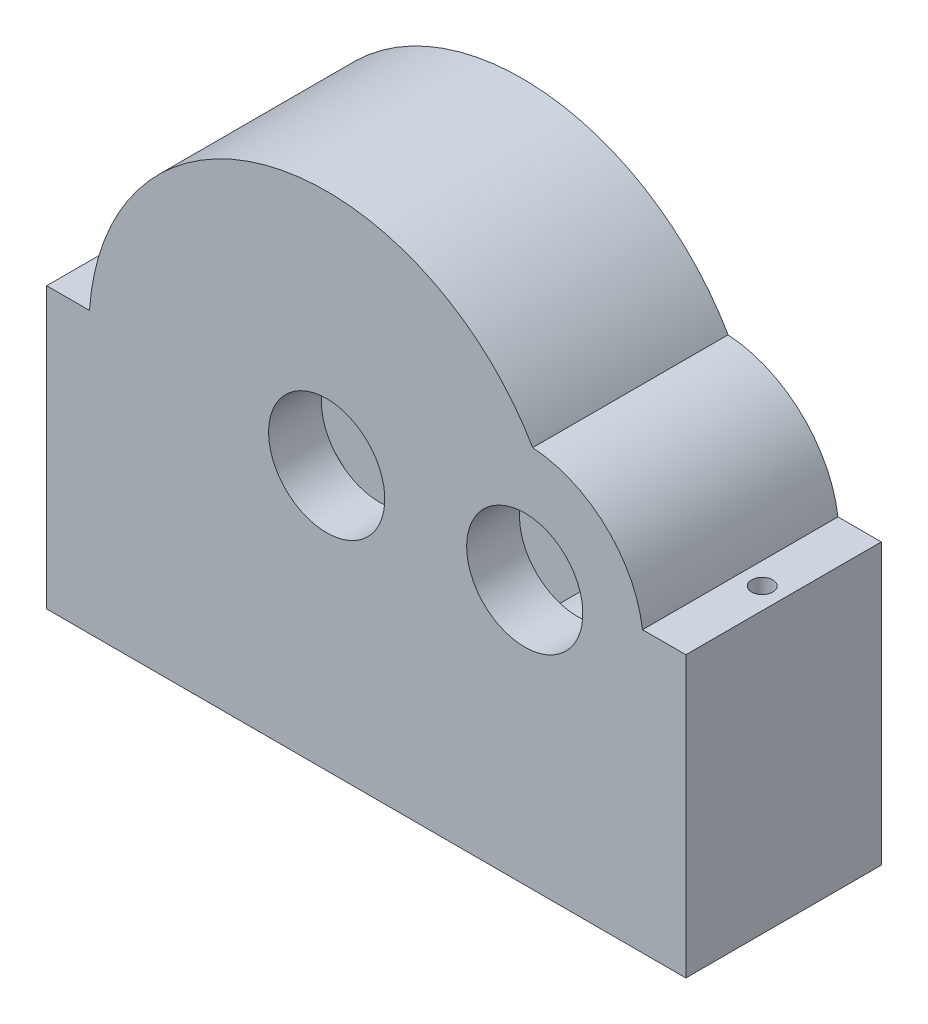
ISO-10303-21;
HEADER;
FILE_DESCRIPTION(('STEP AP214'),'2;1');
FILE_NAME('part.step','',(''),(''),'','','');
FILE_SCHEMA(('AUTOMOTIVE_DESIGN { 1 0 10303 214 1 1 1 1 }'));
ENDSEC;
DATA;
#1=APPLICATION_CONTEXT('core data for automotive mechanical design processes');
#2=APPLICATION_PROTOCOL_DEFINITION('international standard','automotive_design',2000,#1);
#3=PRODUCT_CONTEXT('',#1,'mechanical');
#4=PRODUCT('Part','Part','',(#3));
#5=PRODUCT_RELATED_PRODUCT_CATEGORY('part','',(#4));
#6=PRODUCT_DEFINITION_FORMATION('','',#4);
#7=PRODUCT_DEFINITION_CONTEXT('part definition',#1,'design');
#8=PRODUCT_DEFINITION('design','',#6,#7);
#9=PRODUCT_DEFINITION_SHAPE('','',#8);
#10=(LENGTH_UNIT() NAMED_UNIT(*) SI_UNIT(.MILLI.,.METRE.));
#11=(NAMED_UNIT(*) PLANE_ANGLE_UNIT() SI_UNIT($,.RADIAN.));
#12=(NAMED_UNIT(*) SI_UNIT($,.STERADIAN.) SOLID_ANGLE_UNIT());
#13=UNCERTAINTY_MEASURE_WITH_UNIT(LENGTH_MEASURE(1.E-05),#10,'distance_accuracy_value','');
#14=(GEOMETRIC_REPRESENTATION_CONTEXT(3) GLOBAL_UNCERTAINTY_ASSIGNED_CONTEXT((#13)) GLOBAL_UNIT_ASSIGNED_CONTEXT((#10,
#11,#12)) REPRESENTATION_CONTEXT('',''));
#15=CARTESIAN_POINT('',(0.,0.,0.));
#16=DIRECTION('',(0.,0.,1.));
#17=DIRECTION('',(1.,0.,0.));
#18=AXIS2_PLACEMENT_3D('',#15,#16,#17);
#19=CARTESIAN_POINT('',(-18.75,0.,27.));
#20=DIRECTION('',(0.,0.,-1.));
#21=DIRECTION('',(-1.,0.,0.));
#22=AXIS2_PLACEMENT_3D('',#19,#20,#21);
#23=CYLINDRICAL_SURFACE('',#22,45.);
#24=CARTESIAN_POINT('',(-18.75,0.,-10.));
#25=DIRECTION('',(0.,0.,-1.));
#26=DIRECTION('',(-1.,0.,0.));
#27=AXIS2_PLACEMENT_3D('',#24,#25,#26);
#28=CIRCLE('',#27,45.);
#29=CARTESIAN_POINT('',(-63.6498886412873,3.,-10.));
#30=VERTEX_POINT('',#29);
#31=CARTESIAN_POINT('',(20.25,22.4499443206437,-10.));
#32=VERTEX_POINT('',#31);
#33=EDGE_CURVE('E188',#30,#32,#28,.T.);
#34=ORIENTED_EDGE('',*,*,#33,.F.);
#35=DIRECTION('',(0.,0.,-1.));
#36=VECTOR('',#35,1.);
#37=CARTESIAN_POINT('',(-63.6498886412873,3.,27.));
#38=LINE('',#37,#36);
#39=CARTESIAN_POINT('',(-63.6498886412873,3.,27.));
#40=VERTEX_POINT('',#39);
#41=EDGE_CURVE('E68',#30,#40,#38,.F.);
#42=ORIENTED_EDGE('',*,*,#41,.T.);
#43=CARTESIAN_POINT('',(-18.75,0.,27.));
#44=DIRECTION('',(0.,0.,1.));
#45=DIRECTION('',(1.,0.,0.));
#46=AXIS2_PLACEMENT_3D('',#43,#44,#45);
#47=CIRCLE('',#46,45.);
#48=CARTESIAN_POINT('',(20.25,22.4499443206437,27.));
#49=VERTEX_POINT('',#48);
#50=EDGE_CURVE('E52',#49,#40,#47,.T.);
#51=ORIENTED_EDGE('',*,*,#50,.F.);
#52=DIRECTION('',(0.,0.,-1.));
#53=VECTOR('',#52,1.);
#54=CARTESIAN_POINT('',(20.25,22.4499443206437,27.));
#55=LINE('',#54,#53);
#56=EDGE_CURVE('E11',#49,#32,#55,.T.);
#57=ORIENTED_EDGE('',*,*,#56,.T.);
#58=EDGE_LOOP('',(#34,#42,#51,#57));
#59=FACE_BOUND('',#58,.T.);
#60=ADVANCED_FACE('F43',(#59),#23,.T.);
#61=CARTESIAN_POINT('',(0.,0.,0.));
#62=DIRECTION('',(0.,0.,-1.));
#63=DIRECTION('',(-1.,0.,0.));
#64=AXIS2_PLACEMENT_3D('',#61,#62,#63);
#65=PLANE('',#64);
#66=CARTESIAN_POINT('',(18.75,0.,0.));
#67=DIRECTION('',(0.,0.,-1.));
#68=DIRECTION('',(-1.,0.,0.));
#69=AXIS2_PLACEMENT_3D('',#66,#67,#68);
#70=CIRCLE('',#69,11.);
#71=CARTESIAN_POINT('',(7.75,0.,0.));
#72=VERTEX_POINT('',#71);
#73=EDGE_CURVE('E185',#72,#72,#70,.T.);
#74=ORIENTED_EDGE('',*,*,#73,.T.);
#75=EDGE_LOOP('',(#74));
#76=FACE_BOUND('',#75,.T.);
#77=CARTESIAN_POINT('',(-18.75,0.,0.));
#78=DIRECTION('',(0.,0.,-1.));
#79=DIRECTION('',(-1.,0.,0.));
#80=AXIS2_PLACEMENT_3D('',#77,#78,#79);
#81=CIRCLE('',#80,11.);
#82=CARTESIAN_POINT('',(-29.75,0.,0.));
#83=VERTEX_POINT('',#82);
#84=EDGE_CURVE('E182',#83,#83,#81,.T.);
#85=ORIENTED_EDGE('',*,*,#84,.T.);
#86=EDGE_LOOP('',(#85));
#87=FACE_BOUND('',#86,.T.);
#88=CARTESIAN_POINT('',(18.75,0.,0.));
#89=DIRECTION('',(0.,0.,1.));
#90=DIRECTION('',(1.,0.,0.));
#91=AXIS2_PLACEMENT_3D('',#88,#89,#90);
#92=CIRCLE('',#91,12.5);
#93=CARTESIAN_POINT('',(14.25,-11.6619037896906,0.));
#94=VERTEX_POINT('',#93);
#95=CARTESIAN_POINT('',(14.25,11.6619037896906,0.));
#96=VERTEX_POINT('',#95);
#97=EDGE_CURVE('E193',#94,#96,#92,.T.);
#98=ORIENTED_EDGE('',*,*,#97,.T.);
#99=CARTESIAN_POINT('',(-18.75,0.,0.));
#100=DIRECTION('',(0.,0.,1.));
#101=DIRECTION('',(1.,0.,0.));
#102=AXIS2_PLACEMENT_3D('',#99,#100,#101);
#103=CIRCLE('',#102,35.);
#104=EDGE_CURVE('E201',#96,#94,#103,.T.);
#105=ORIENTED_EDGE('',*,*,#104,.T.);
#106=EDGE_LOOP('',(#98,#105));
#107=FACE_BOUND('',#106,.T.);
#108=ADVANCED_FACE('F239',(#76,#87,#107),#65,.F.);
#109=CARTESIAN_POINT('',(0.,0.,17.));
#110=DIRECTION('',(0.,0.,1.));
#111=DIRECTION('',(1.,0.,0.));
#112=AXIS2_PLACEMENT_3D('',#109,#110,#111);
#113=PLANE('',#112);
#114=CARTESIAN_POINT('',(18.75,0.,17.));
#115=DIRECTION('',(0.,0.,1.));
#116=DIRECTION('',(1.,0.,0.));
#117=AXIS2_PLACEMENT_3D('',#114,#115,#116);
#118=CIRCLE('',#117,11.);
#119=CARTESIAN_POINT('',(29.75,0.,17.));
#120=VERTEX_POINT('',#119);
#121=EDGE_CURVE('E47',#120,#120,#118,.T.);
#122=ORIENTED_EDGE('',*,*,#121,.T.);
#123=EDGE_LOOP('',(#122));
#124=FACE_BOUND('',#123,.T.);
#125=CARTESIAN_POINT('',(-18.75,0.,17.));
#126=DIRECTION('',(0.,0.,1.));
#127=DIRECTION('',(1.,0.,0.));
#128=AXIS2_PLACEMENT_3D('',#125,#126,#127);
#129=CIRCLE('',#128,11.);
#130=CARTESIAN_POINT('',(-7.75,0.,17.));
#131=VERTEX_POINT('',#130);
#132=EDGE_CURVE('E173',#131,#131,#129,.T.);
#133=ORIENTED_EDGE('',*,*,#132,.T.);
#134=EDGE_LOOP('',(#133));
#135=FACE_BOUND('',#134,.T.);
#136=CARTESIAN_POINT('',(18.75,0.,17.));
#137=DIRECTION('',(0.,0.,1.));
#138=DIRECTION('',(1.,0.,0.));
#139=AXIS2_PLACEMENT_3D('',#136,#137,#138);
#140=CIRCLE('',#139,12.5);
#141=CARTESIAN_POINT('',(14.25,-11.6619037896906,17.));
#142=VERTEX_POINT('',#141);
#143=CARTESIAN_POINT('',(14.25,11.6619037896906,17.));
#144=VERTEX_POINT('',#143);
#145=EDGE_CURVE('E197',#142,#144,#140,.T.);
#146=ORIENTED_EDGE('',*,*,#145,.F.);
#147=CARTESIAN_POINT('',(-18.75,0.,17.));
#148=DIRECTION('',(0.,0.,1.));
#149=DIRECTION('',(1.,0.,0.));
#150=AXIS2_PLACEMENT_3D('',#147,#148,#149);
#151=CIRCLE('',#150,35.);
#152=EDGE_CURVE('E200',#144,#142,#151,.T.);
#153=ORIENTED_EDGE('',*,*,#152,.F.);
#154=EDGE_LOOP('',(#146,#153));
#155=FACE_BOUND('',#154,.T.);
#156=ADVANCED_FACE('F213',(#124,#135,#155),#113,.F.);
#157=CARTESIAN_POINT('',(18.75,0.,27.));
#158=DIRECTION('',(0.,0.,-1.));
#159=DIRECTION('',(-1.,0.,0.));
#160=AXIS2_PLACEMENT_3D('',#157,#158,#159);
#161=CYLINDRICAL_SURFACE('',#160,12.5);
#162=ORIENTED_EDGE('',*,*,#97,.F.);
#163=DIRECTION('',(0.,0.,-1.));
#164=VECTOR('',#163,1.);
#165=CARTESIAN_POINT('',(14.25,-11.6619037896906,17.));
#166=LINE('',#165,#164);
#167=EDGE_CURVE('E196',#142,#94,#166,.T.);
#168=ORIENTED_EDGE('',*,*,#167,.F.);
#169=ORIENTED_EDGE('',*,*,#145,.T.);
#170=DIRECTION('',(0.,0.,-1.));
#171=VECTOR('',#170,1.);
#172=CARTESIAN_POINT('',(14.25,11.6619037896906,17.));
#173=LINE('',#172,#171);
#174=EDGE_CURVE('E194',#144,#96,#173,.T.);
#175=ORIENTED_EDGE('',*,*,#174,.T.);
#176=EDGE_LOOP('',(#162,#168,#169,#175));
#177=FACE_BOUND('',#176,.T.);
#178=ADVANCED_FACE('F231',(#177),#161,.F.);
#179=CARTESIAN_POINT('',(-18.75,0.,27.));
#180=DIRECTION('',(0.,0.,-1.));
#181=DIRECTION('',(-1.,0.,0.));
#182=AXIS2_PLACEMENT_3D('',#179,#180,#181);
#183=CYLINDRICAL_SURFACE('',#182,35.);
#184=ORIENTED_EDGE('',*,*,#104,.F.);
#185=ORIENTED_EDGE('',*,*,#174,.F.);
#186=ORIENTED_EDGE('',*,*,#152,.T.);
#187=ORIENTED_EDGE('',*,*,#167,.T.);
#188=EDGE_LOOP('',(#184,#185,#186,#187));
#189=FACE_BOUND('',#188,.T.);
#190=ADVANCED_FACE('F219',(#189),#183,.F.);
#191=CARTESIAN_POINT('',(-18.75,0.,27.));
#192=DIRECTION('',(0.,0.,-1.));
#193=DIRECTION('',(-1.,0.,0.));
#194=AXIS2_PLACEMENT_3D('',#191,#192,#193);
#195=CYLINDRICAL_SURFACE('',#194,11.);
#196=CARTESIAN_POINT('',(-18.75,0.,27.));
#197=DIRECTION('',(0.,0.,-1.));
#198=DIRECTION('',(-1.,0.,0.));
#199=AXIS2_PLACEMENT_3D('',#196,#197,#198);
#200=CIRCLE('',#199,11.);
#201=CARTESIAN_POINT('',(-29.75,0.,27.));
#202=VERTEX_POINT('',#201);
#203=EDGE_CURVE('E177',#202,#202,#200,.T.);
#204=ORIENTED_EDGE('',*,*,#203,.F.);
#205=EDGE_LOOP('',(#204));
#206=FACE_BOUND('',#205,.T.);
#207=ORIENTED_EDGE('',*,*,#132,.F.);
#208=EDGE_LOOP('',(#207));
#209=FACE_BOUND('',#208,.T.);
#210=ADVANCED_FACE('F216',(#206,#209),#195,.F.);
#211=CARTESIAN_POINT('',(18.75,0.,27.));
#212=DIRECTION('',(0.,0.,-1.));
#213=DIRECTION('',(-1.,0.,0.));
#214=AXIS2_PLACEMENT_3D('',#211,#212,#213);
#215=CYLINDRICAL_SURFACE('',#214,11.);
#216=CARTESIAN_POINT('',(18.75,0.,27.));
#217=DIRECTION('',(0.,0.,-1.));
#218=DIRECTION('',(-1.,0.,0.));
#219=AXIS2_PLACEMENT_3D('',#216,#217,#218);
#220=CIRCLE('',#219,11.);
#221=CARTESIAN_POINT('',(7.75,0.,27.));
#222=VERTEX_POINT('',#221);
#223=EDGE_CURVE('E170',#222,#222,#220,.T.);
#224=ORIENTED_EDGE('',*,*,#223,.F.);
#225=EDGE_LOOP('',(#224));
#226=FACE_BOUND('',#225,.T.);
#227=ORIENTED_EDGE('',*,*,#121,.F.);
#228=EDGE_LOOP('',(#227));
#229=FACE_BOUND('',#228,.T.);
#230=ADVANCED_FACE('F218',(#226,#229),#215,.F.);
#231=CARTESIAN_POINT('',(-18.75,0.,-10.));
#232=DIRECTION('',(0.,0.,-1.));
#233=DIRECTION('',(-1.,0.,0.));
#234=AXIS2_PLACEMENT_3D('',#231,#232,#233);
#235=CIRCLE('',#234,11.);
#236=CARTESIAN_POINT('',(-29.75,0.,-10.));
#237=VERTEX_POINT('',#236);
#238=EDGE_CURVE('E169',#237,#237,#235,.T.);
#239=ORIENTED_EDGE('',*,*,#238,.T.);
#240=EDGE_LOOP('',(#239));
#241=FACE_BOUND('',#240,.T.);
#242=ORIENTED_EDGE('',*,*,#84,.F.);
#243=EDGE_LOOP('',(#242));
#244=FACE_BOUND('',#243,.T.);
#245=ADVANCED_FACE('F222',(#241,#244),#195,.F.);
#246=CARTESIAN_POINT('',(18.75,0.,-10.));
#247=DIRECTION('',(0.,0.,-1.));
#248=DIRECTION('',(-1.,0.,0.));
#249=AXIS2_PLACEMENT_3D('',#246,#247,#248);
#250=CIRCLE('',#249,11.);
#251=CARTESIAN_POINT('',(7.75,0.,-10.));
#252=VERTEX_POINT('',#251);
#253=EDGE_CURVE('E174',#252,#252,#250,.T.);
#254=ORIENTED_EDGE('',*,*,#253,.T.);
#255=EDGE_LOOP('',(#254));
#256=FACE_BOUND('',#255,.T.);
#257=ORIENTED_EDGE('',*,*,#73,.F.);
#258=EDGE_LOOP('',(#257));
#259=FACE_BOUND('',#258,.T.);
#260=ADVANCED_FACE('F229',(#256,#259),#215,.F.);
#261=CARTESIAN_POINT('',(18.75,0.,27.));
#262=DIRECTION('',(0.,0.,-1.));
#263=DIRECTION('',(-1.,0.,0.));
#264=AXIS2_PLACEMENT_3D('',#261,#262,#263);
#265=CYLINDRICAL_SURFACE('',#264,22.5);
#266=CARTESIAN_POINT('',(18.75,0.,27.));
#267=DIRECTION('',(0.,0.,1.));
#268=DIRECTION('',(1.,0.,0.));
#269=AXIS2_PLACEMENT_3D('',#266,#267,#268);
#270=CIRCLE('',#269,22.5);
#271=CARTESIAN_POINT('',(41.0491031209778,3.,27.));
#272=VERTEX_POINT('',#271);
#273=EDGE_CURVE('E60',#272,#49,#270,.T.);
#274=ORIENTED_EDGE('',*,*,#273,.F.);
#275=DIRECTION('',(0.,0.,-1.));
#276=VECTOR('',#275,1.);
#277=CARTESIAN_POINT('',(41.0491031209778,3.,27.));
#278=LINE('',#277,#276);
#279=CARTESIAN_POINT('',(41.0491031209778,3.,-10.));
#280=VERTEX_POINT('',#279);
#281=EDGE_CURVE('E145',#272,#280,#278,.T.);
#282=ORIENTED_EDGE('',*,*,#281,.T.);
#283=CARTESIAN_POINT('',(18.75,0.,-10.));
#284=DIRECTION('',(0.,0.,-1.));
#285=DIRECTION('',(-1.,0.,0.));
#286=AXIS2_PLACEMENT_3D('',#283,#284,#285);
#287=CIRCLE('',#286,22.5);
#288=EDGE_CURVE('E190',#32,#280,#287,.T.);
#289=ORIENTED_EDGE('',*,*,#288,.F.);
#290=ORIENTED_EDGE('',*,*,#56,.F.);
#291=EDGE_LOOP('',(#274,#282,#289,#290));
#292=FACE_BOUND('',#291,.T.);
#293=ADVANCED_FACE('F45',(#292),#265,.T.);
#294=CARTESIAN_POINT('',(0.,0.,27.));
#295=DIRECTION('',(0.,0.,1.));
#296=DIRECTION('',(1.,0.,0.));
#297=AXIS2_PLACEMENT_3D('',#294,#295,#296);
#298=PLANE('',#297);
#299=DIRECTION('',(-1.,0.,0.));
#300=VECTOR('',#299,1.);
#301=CARTESIAN_POINT('',(0.,3.,27.));
#302=LINE('',#301,#300);
#303=CARTESIAN_POINT('',(49.25,3.,27.));
#304=VERTEX_POINT('',#303);
#305=EDGE_CURVE('E147',#304,#272,#302,.T.);
#306=ORIENTED_EDGE('',*,*,#305,.T.);
#307=ORIENTED_EDGE('',*,*,#273,.T.);
#308=ORIENTED_EDGE('',*,*,#50,.T.);
#309=DIRECTION('',(1.,0.,0.));
#310=VECTOR('',#309,1.);
#311=CARTESIAN_POINT('',(0.,3.,27.));
#312=LINE('',#311,#310);
#313=CARTESIAN_POINT('',(-71.75,3.,27.));
#314=VERTEX_POINT('',#313);
#315=EDGE_CURVE('E125',#314,#40,#312,.T.);
#316=ORIENTED_EDGE('',*,*,#315,.F.);
#317=DIRECTION('',(0.,1.,0.));
#318=VECTOR('',#317,1.);
#319=CARTESIAN_POINT('',(-71.75,-89.2173431022552,27.));
#320=LINE('',#319,#318);
#321=CARTESIAN_POINT('',(-71.75,-50.,27.));
#322=VERTEX_POINT('',#321);
#323=EDGE_CURVE('E140',#322,#314,#320,.T.);
#324=ORIENTED_EDGE('',*,*,#323,.F.);
#325=DIRECTION('',(-1.,0.,0.));
#326=VECTOR('',#325,1.);
#327=CARTESIAN_POINT('',(41.25,-50.,27.));
#328=LINE('',#327,#326);
#329=CARTESIAN_POINT('',(49.25,-50.,27.));
#330=VERTEX_POINT('',#329);
#331=EDGE_CURVE('E167',#330,#322,#328,.T.);
#332=ORIENTED_EDGE('',*,*,#331,.F.);
#333=DIRECTION('',(0.,1.,0.));
#334=VECTOR('',#333,1.);
#335=CARTESIAN_POINT('',(49.25,-89.2173431022552,27.));
#336=LINE('',#335,#334);
#337=EDGE_CURVE('E160',#330,#304,#336,.T.);
#338=ORIENTED_EDGE('',*,*,#337,.T.);
#339=EDGE_LOOP('',(#306,#307,#308,#316,#324,#332,#338));
#340=FACE_BOUND('',#339,.T.);
#341=ORIENTED_EDGE('',*,*,#223,.T.);
#342=EDGE_LOOP('',(#341));
#343=FACE_BOUND('',#342,.T.);
#344=ORIENTED_EDGE('',*,*,#203,.T.);
#345=EDGE_LOOP('',(#344));
#346=FACE_BOUND('',#345,.T.);
#347=ADVANCED_FACE('F248',(#340,#343,#346),#298,.T.);
#348=CARTESIAN_POINT('',(0.,0.,-10.));
#349=DIRECTION('',(0.,0.,-1.));
#350=DIRECTION('',(-1.,0.,0.));
#351=AXIS2_PLACEMENT_3D('',#348,#349,#350);
#352=PLANE('',#351);
#353=DIRECTION('',(-1.,0.,0.));
#354=VECTOR('',#353,1.);
#355=CARTESIAN_POINT('',(0.,3.,-10.));
#356=LINE('',#355,#354);
#357=CARTESIAN_POINT('',(-71.75,3.,-10.));
#358=VERTEX_POINT('',#357);
#359=EDGE_CURVE('E117',#30,#358,#356,.T.);
#360=ORIENTED_EDGE('',*,*,#359,.F.);
#361=ORIENTED_EDGE('',*,*,#33,.T.);
#362=ORIENTED_EDGE('',*,*,#288,.T.);
#363=DIRECTION('',(1.,0.,0.));
#364=VECTOR('',#363,1.);
#365=CARTESIAN_POINT('',(0.,3.,-9.99999999999999));
#366=LINE('',#365,#364);
#367=CARTESIAN_POINT('',(49.25,3.,-9.99999999999999));
#368=VERTEX_POINT('',#367);
#369=EDGE_CURVE('E154',#280,#368,#366,.T.);
#370=ORIENTED_EDGE('',*,*,#369,.T.);
#371=DIRECTION('',(0.,1.,0.));
#372=VECTOR('',#371,1.);
#373=CARTESIAN_POINT('',(49.25,-89.2173431022552,-9.99999999999999));
#374=LINE('',#373,#372);
#375=CARTESIAN_POINT('',(49.25,-50.,-9.99999999999999));
#376=VERTEX_POINT('',#375);
#377=EDGE_CURVE('E156',#376,#368,#374,.T.);
#378=ORIENTED_EDGE('',*,*,#377,.F.);
#379=DIRECTION('',(-1.,0.,0.));
#380=VECTOR('',#379,1.);
#381=CARTESIAN_POINT('',(41.25,-50.,-10.));
#382=LINE('',#381,#380);
#383=CARTESIAN_POINT('',(-71.75,-50.,-10.));
#384=VERTEX_POINT('',#383);
#385=EDGE_CURVE('E132',#376,#384,#382,.T.);
#386=ORIENTED_EDGE('',*,*,#385,.T.);
#387=DIRECTION('',(0.,1.,0.));
#388=VECTOR('',#387,1.);
#389=CARTESIAN_POINT('',(-71.75,-89.2173431022552,-10.));
#390=LINE('',#389,#388);
#391=EDGE_CURVE('E128',#384,#358,#390,.T.);
#392=ORIENTED_EDGE('',*,*,#391,.T.);
#393=EDGE_LOOP('',(#360,#361,#362,#370,#378,#386,#392));
#394=FACE_BOUND('',#393,.T.);
#395=ORIENTED_EDGE('',*,*,#253,.F.);
#396=EDGE_LOOP('',(#395));
#397=FACE_BOUND('',#396,.T.);
#398=ORIENTED_EDGE('',*,*,#238,.F.);
#399=EDGE_LOOP('',(#398));
#400=FACE_BOUND('',#399,.T.);
#401=ADVANCED_FACE('F129',(#394,#397,#400),#352,.T.);
#402=CARTESIAN_POINT('',(41.25,-50.,143.29703349613));
#403=DIRECTION('',(0.,-1.,0.));
#404=DIRECTION('',(0.,0.,-1.));
#405=AXIS2_PLACEMENT_3D('',#402,#403,#404);
#406=PLANE('',#405);
#407=ORIENTED_EDGE('',*,*,#331,.T.);
#408=DIRECTION('',(0.,0.,1.));
#409=VECTOR('',#408,1.);
#410=CARTESIAN_POINT('',(-71.75,-50.,0.));
#411=LINE('',#410,#409);
#412=EDGE_CURVE('E136',#384,#322,#411,.T.);
#413=ORIENTED_EDGE('',*,*,#412,.F.);
#414=ORIENTED_EDGE('',*,*,#385,.F.);
#415=DIRECTION('',(0.,0.,1.));
#416=VECTOR('',#415,1.);
#417=CARTESIAN_POINT('',(49.25,-50.,0.));
#418=LINE('',#417,#416);
#419=EDGE_CURVE('E157',#376,#330,#418,.T.);
#420=ORIENTED_EDGE('',*,*,#419,.T.);
#421=EDGE_LOOP('',(#407,#413,#414,#420));
#422=FACE_BOUND('',#421,.T.);
#423=ADVANCED_FACE('F257',(#422),#406,.T.);
#424=CARTESIAN_POINT('',(0.,3.,0.));
#425=DIRECTION('',(0.,1.,0.));
#426=DIRECTION('',(0.,0.,1.));
#427=AXIS2_PLACEMENT_3D('',#424,#425,#426);
#428=PLANE('',#427);
#429=CARTESIAN_POINT('',(-67.6999443206437,3.,8.5));
#430=DIRECTION('',(0.,1.,0.));
#431=DIRECTION('',(0.,0.,1.));
#432=AXIS2_PLACEMENT_3D('',#429,#430,#431);
#433=CIRCLE('',#432,2.);
#434=CARTESIAN_POINT('',(-67.6999443206437,3.,10.5));
#435=VERTEX_POINT('',#434);
#436=EDGE_CURVE('E393',#435,#435,#433,.T.);
#437=ORIENTED_EDGE('',*,*,#436,.F.);
#438=EDGE_LOOP('',(#437));
#439=FACE_BOUND('',#438,.T.);
#440=ORIENTED_EDGE('',*,*,#41,.F.);
#441=ORIENTED_EDGE('',*,*,#359,.T.);
#442=DIRECTION('',(0.,0.,1.));
#443=VECTOR('',#442,1.);
#444=CARTESIAN_POINT('',(-71.75,3.,0.));
#445=LINE('',#444,#443);
#446=EDGE_CURVE('E122',#358,#314,#445,.T.);
#447=ORIENTED_EDGE('',*,*,#446,.T.);
#448=ORIENTED_EDGE('',*,*,#315,.T.);
#449=EDGE_LOOP('',(#440,#441,#447,#448));
#450=FACE_BOUND('',#449,.T.);
#451=ADVANCED_FACE('F119',(#439,#450),#428,.T.);
#452=CARTESIAN_POINT('',(-71.75,-89.2173431022552,0.));
#453=DIRECTION('',(-1.,0.,0.));
#454=DIRECTION('',(0.,0.,1.));
#455=AXIS2_PLACEMENT_3D('',#452,#453,#454);
#456=PLANE('',#455);
#457=ORIENTED_EDGE('',*,*,#391,.F.);
#458=ORIENTED_EDGE('',*,*,#412,.T.);
#459=ORIENTED_EDGE('',*,*,#323,.T.);
#460=ORIENTED_EDGE('',*,*,#446,.F.);
#461=EDGE_LOOP('',(#457,#458,#459,#460));
#462=FACE_BOUND('',#461,.T.);
#463=ADVANCED_FACE('F138',(#462),#456,.T.);
#464=CARTESIAN_POINT('',(0.,3.,0.));
#465=DIRECTION('',(0.,1.,0.));
#466=DIRECTION('',(0.,0.,1.));
#467=AXIS2_PLACEMENT_3D('',#464,#465,#466);
#468=PLANE('',#467);
#469=CARTESIAN_POINT('',(45.1999443206437,3.,8.5));
#470=DIRECTION('',(0.,-1.,0.));
#471=DIRECTION('',(0.,0.,-1.));
#472=AXIS2_PLACEMENT_3D('',#469,#470,#471);
#473=CIRCLE('',#472,2.);
#474=CARTESIAN_POINT('',(45.1999443206437,3.,6.5));
#475=VERTEX_POINT('',#474);
#476=EDGE_CURVE('E396',#475,#475,#473,.T.);
#477=ORIENTED_EDGE('',*,*,#476,.T.);
#478=EDGE_LOOP('',(#477));
#479=FACE_BOUND('',#478,.T.);
#480=ORIENTED_EDGE('',*,*,#281,.F.);
#481=ORIENTED_EDGE('',*,*,#305,.F.);
#482=DIRECTION('',(0.,0.,1.));
#483=VECTOR('',#482,1.);
#484=CARTESIAN_POINT('',(49.25,3.,0.));
#485=LINE('',#484,#483);
#486=EDGE_CURVE('E150',#368,#304,#485,.T.);
#487=ORIENTED_EDGE('',*,*,#486,.F.);
#488=ORIENTED_EDGE('',*,*,#369,.F.);
#489=EDGE_LOOP('',(#480,#481,#487,#488));
#490=FACE_BOUND('',#489,.T.);
#491=ADVANCED_FACE('F333',(#479,#490),#468,.T.);
#492=CARTESIAN_POINT('',(49.25,-89.2173431022552,0.));
#493=DIRECTION('',(-1.,0.,0.));
#494=DIRECTION('',(0.,0.,1.));
#495=AXIS2_PLACEMENT_3D('',#492,#493,#494);
#496=PLANE('',#495);
#497=ORIENTED_EDGE('',*,*,#419,.F.);
#498=ORIENTED_EDGE('',*,*,#377,.T.);
#499=ORIENTED_EDGE('',*,*,#486,.T.);
#500=ORIENTED_EDGE('',*,*,#337,.F.);
#501=EDGE_LOOP('',(#497,#498,#499,#500));
#502=FACE_BOUND('',#501,.T.);
#503=ADVANCED_FACE('F270',(#502),#496,.F.);
#504=CARTESIAN_POINT('',(45.1999443206437,-7.,8.5));
#505=DIRECTION('',(0.,1.,0.));
#506=DIRECTION('',(0.,0.,1.));
#507=AXIS2_PLACEMENT_3D('',#504,#505,#506);
#508=CYLINDRICAL_SURFACE('',#507,2.);
#509=CARTESIAN_POINT('',(45.1999443206437,-7.,8.5));
#510=DIRECTION('',(0.,-1.,0.));
#511=DIRECTION('',(0.,0.,-1.));
#512=AXIS2_PLACEMENT_3D('',#509,#510,#511);
#513=CIRCLE('',#512,2.);
#514=CARTESIAN_POINT('',(45.1999443206437,-7.,6.5));
#515=VERTEX_POINT('',#514);
#516=EDGE_CURVE('E151',#515,#515,#513,.T.);
#517=ORIENTED_EDGE('',*,*,#516,.T.);
#518=EDGE_LOOP('',(#517));
#519=FACE_BOUND('',#518,.T.);
#520=ORIENTED_EDGE('',*,*,#476,.F.);
#521=EDGE_LOOP('',(#520));
#522=FACE_BOUND('',#521,.T.);
#523=ADVANCED_FACE('F349',(#519,#522),#508,.F.);
#524=CARTESIAN_POINT('',(45.1999443206437,-7.,8.5));
#525=DIRECTION('',(0.,-1.,0.));
#526=DIRECTION('',(0.,0.,-1.));
#527=AXIS2_PLACEMENT_3D('',#524,#525,#526);
#528=PLANE('',#527);
#529=ORIENTED_EDGE('',*,*,#516,.F.);
#530=EDGE_LOOP('',(#529));
#531=FACE_BOUND('',#530,.T.);
#532=ADVANCED_FACE('F357',(#531),#528,.F.);
#533=CARTESIAN_POINT('',(-67.6999443206437,-7.,8.5));
#534=DIRECTION('',(0.,1.,0.));
#535=DIRECTION('',(0.,0.,1.));
#536=AXIS2_PLACEMENT_3D('',#533,#534,#535);
#537=CYLINDRICAL_SURFACE('',#536,2.);
#538=CARTESIAN_POINT('',(-67.6999443206437,-7.,8.5));
#539=DIRECTION('',(0.,1.,0.));
#540=DIRECTION('',(0.,0.,1.));
#541=AXIS2_PLACEMENT_3D('',#538,#539,#540);
#542=CIRCLE('',#541,2.);
#543=CARTESIAN_POINT('',(-67.6999443206437,-7.,10.5));
#544=VERTEX_POINT('',#543);
#545=EDGE_CURVE('E392',#544,#544,#542,.T.);
#546=ORIENTED_EDGE('',*,*,#545,.F.);
#547=EDGE_LOOP('',(#546));
#548=FACE_BOUND('',#547,.T.);
#549=ORIENTED_EDGE('',*,*,#436,.T.);
#550=EDGE_LOOP('',(#549));
#551=FACE_BOUND('',#550,.T.);
#552=ADVANCED_FACE('F367',(#548,#551),#537,.F.);
#553=CARTESIAN_POINT('',(-67.6999443206437,-7.,8.5));
#554=DIRECTION('',(0.,1.,0.));
#555=DIRECTION('',(0.,0.,1.));
#556=AXIS2_PLACEMENT_3D('',#553,#554,#555);
#557=PLANE('',#556);
#558=ORIENTED_EDGE('',*,*,#545,.T.);
#559=EDGE_LOOP('',(#558));
#560=FACE_BOUND('',#559,.T.);
#561=ADVANCED_FACE('F377',(#560),#557,.T.);
#562=CLOSED_SHELL('',(#60,#108,#156,#178,#190,#210,#230,#245,#260,#293,#347,#401,#423,#451,#463,
#491,#503,#523,#532,#552,#561));
#563=MANIFOLD_SOLID_BREP('B2',#562);
#564=ADVANCED_BREP_SHAPE_REPRESENTATION('',(#18,#563),#14);
#565=SHAPE_DEFINITION_REPRESENTATION(#9,#564);
ENDSEC;
END-ISO-10303-21;
